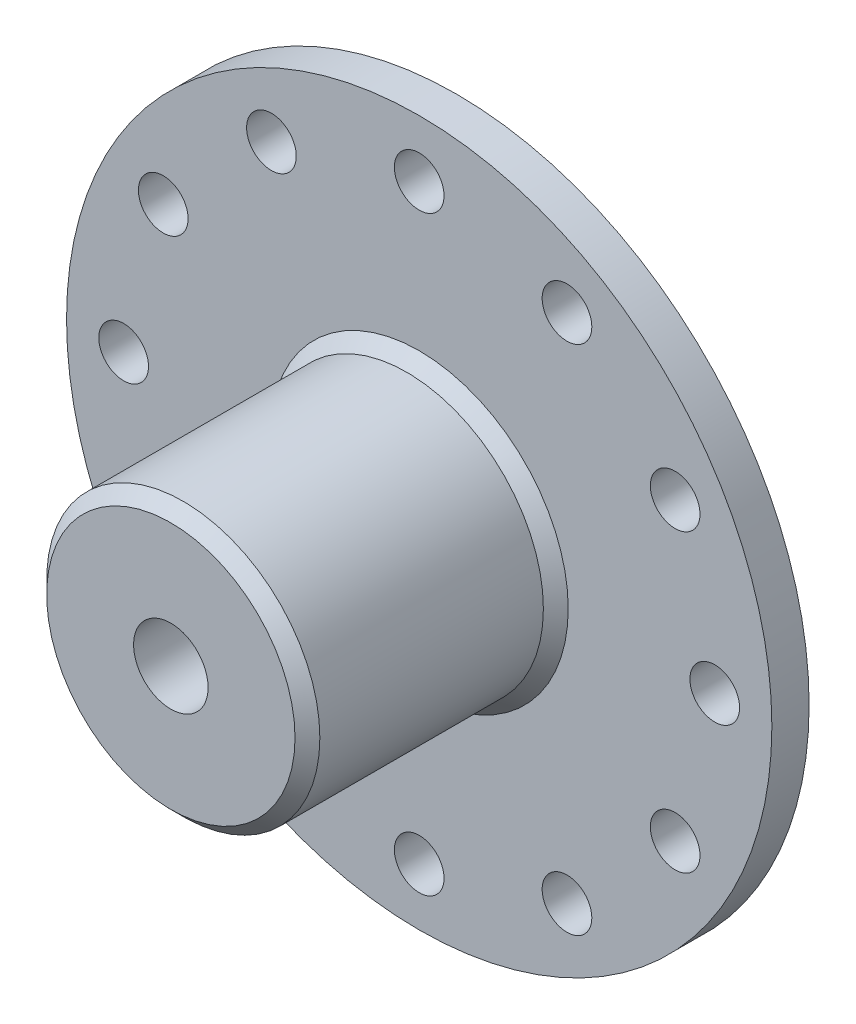
ISO-10303-21;
HEADER;
FILE_DESCRIPTION(('STEP AP214'),'2;1');
FILE_NAME('part.step','',(''),(''),'','','');
FILE_SCHEMA(('AUTOMOTIVE_DESIGN { 1 0 10303 214 1 1 1 1 }'));
ENDSEC;
DATA;
#1=APPLICATION_CONTEXT('core data for automotive mechanical design processes');
#2=APPLICATION_PROTOCOL_DEFINITION('international standard','automotive_design',2000,#1);
#3=PRODUCT_CONTEXT('',#1,'mechanical');
#4=PRODUCT('Part','Part','',(#3));
#5=PRODUCT_RELATED_PRODUCT_CATEGORY('part','',(#4));
#6=PRODUCT_DEFINITION_FORMATION('','',#4);
#7=PRODUCT_DEFINITION_CONTEXT('part definition',#1,'design');
#8=PRODUCT_DEFINITION('design','',#6,#7);
#9=PRODUCT_DEFINITION_SHAPE('','',#8);
#10=(LENGTH_UNIT() NAMED_UNIT(*) SI_UNIT(.MILLI.,.METRE.));
#11=(NAMED_UNIT(*) PLANE_ANGLE_UNIT() SI_UNIT($,.RADIAN.));
#12=(NAMED_UNIT(*) SI_UNIT($,.STERADIAN.) SOLID_ANGLE_UNIT());
#13=UNCERTAINTY_MEASURE_WITH_UNIT(LENGTH_MEASURE(1.E-05),#10,'distance_accuracy_value','');
#14=(GEOMETRIC_REPRESENTATION_CONTEXT(3) GLOBAL_UNCERTAINTY_ASSIGNED_CONTEXT((#13)) GLOBAL_UNIT_ASSIGNED_CONTEXT((#10,
#11,#12)) REPRESENTATION_CONTEXT('',''));
#15=CARTESIAN_POINT('',(0.,0.,0.));
#16=DIRECTION('',(0.,0.,1.));
#17=DIRECTION('',(1.,0.,0.));
#18=AXIS2_PLACEMENT_3D('',#15,#16,#17);
#19=CARTESIAN_POINT('',(0.,0.,3.));
#20=DIRECTION('',(0.,0.,-1.));
#21=DIRECTION('',(-1.,0.,0.));
#22=AXIS2_PLACEMENT_3D('',#19,#20,#21);
#23=CYLINDRICAL_SURFACE('',#22,28.4);
#24=CARTESIAN_POINT('',(0.,0.,3.));
#25=DIRECTION('',(0.,0.,1.));
#26=DIRECTION('',(1.,0.,0.));
#27=AXIS2_PLACEMENT_3D('',#24,#25,#26);
#28=CIRCLE('',#27,28.4);
#29=CARTESIAN_POINT('',(28.4,0.,3.));
#30=VERTEX_POINT('',#29);
#31=EDGE_CURVE('E55',#30,#30,#28,.T.);
#32=ORIENTED_EDGE('',*,*,#31,.F.);
#33=EDGE_LOOP('',(#32));
#34=FACE_BOUND('',#33,.T.);
#35=CARTESIAN_POINT('',(0.,0.,0.));
#36=DIRECTION('',(0.,0.,1.));
#37=DIRECTION('',(1.,0.,0.));
#38=AXIS2_PLACEMENT_3D('',#35,#36,#37);
#39=CIRCLE('',#38,28.4);
#40=CARTESIAN_POINT('',(28.4,0.,0.));
#41=VERTEX_POINT('',#40);
#42=EDGE_CURVE('E66',#41,#41,#39,.T.);
#43=ORIENTED_EDGE('',*,*,#42,.T.);
#44=EDGE_LOOP('',(#43));
#45=FACE_BOUND('',#44,.T.);
#46=ADVANCED_FACE('F35',(#34,#45),#23,.T.);
#47=CARTESIAN_POINT('',(0.,0.,3.));
#48=DIRECTION('',(0.,0.,1.));
#49=DIRECTION('',(1.,0.,0.));
#50=AXIS2_PLACEMENT_3D('',#47,#48,#49);
#51=PLANE('',#50);
#52=CARTESIAN_POINT('',(-11.8999999999999,20.6114046100697,3.));
#53=DIRECTION('',(0.,0.,1.));
#54=DIRECTION('',(0.499999999999998,0.86602540378444,0.));
#55=AXIS2_PLACEMENT_3D('',#52,#53,#54);
#56=CIRCLE('',#55,2.00000000000002);
#57=CARTESIAN_POINT('',(-10.8999999999999,22.3434554176386,3.));
#58=VERTEX_POINT('',#57);
#59=EDGE_CURVE('E204',#58,#58,#56,.T.);
#60=ORIENTED_EDGE('',*,*,#59,.F.);
#61=EDGE_LOOP('',(#60));
#62=FACE_BOUND('',#61,.T.);
#63=CARTESIAN_POINT('',(-20.6114046100696,11.9000000000001,3.));
#64=DIRECTION('',(0.,0.,1.));
#65=DIRECTION('',(0.,1.,0.));
#66=AXIS2_PLACEMENT_3D('',#63,#64,#65);
#67=CIRCLE('',#66,2.00000000000002);
#68=CARTESIAN_POINT('',(-20.6114046100696,13.9000000000001,3.));
#69=VERTEX_POINT('',#68);
#70=EDGE_CURVE('E198',#69,#69,#67,.T.);
#71=ORIENTED_EDGE('',*,*,#70,.F.);
#72=EDGE_LOOP('',(#71));
#73=FACE_BOUND('',#72,.T.);
#74=CARTESIAN_POINT('',(-23.8,0.,3.));
#75=DIRECTION('',(0.,0.,1.));
#76=DIRECTION('',(-0.500000000000004,0.866025403784436,0.));
#77=AXIS2_PLACEMENT_3D('',#74,#75,#76);
#78=CIRCLE('',#77,2.00000000000002);
#79=CARTESIAN_POINT('',(-24.8,1.73205080756898,3.));
#80=VERTEX_POINT('',#79);
#81=EDGE_CURVE('E192',#80,#80,#78,.T.);
#82=ORIENTED_EDGE('',*,*,#81,.F.);
#83=EDGE_LOOP('',(#82));
#84=FACE_BOUND('',#83,.T.);
#85=CARTESIAN_POINT('',(-20.6114046100697,-11.8999999999999,3.));
#86=DIRECTION('',(0.,0.,1.));
#87=DIRECTION('',(-0.866025403784442,0.499999999999995,0.));
#88=AXIS2_PLACEMENT_3D('',#85,#86,#87);
#89=CIRCLE('',#88,2.00000000000002);
#90=CARTESIAN_POINT('',(-22.3434554176386,-10.8999999999999,3.));
#91=VERTEX_POINT('',#90);
#92=EDGE_CURVE('E186',#91,#91,#89,.T.);
#93=ORIENTED_EDGE('',*,*,#92,.F.);
#94=EDGE_LOOP('',(#93));
#95=FACE_BOUND('',#94,.T.);
#96=CARTESIAN_POINT('',(-11.9000000000002,-20.6114046100695,3.));
#97=DIRECTION('',(0.,0.,1.));
#98=DIRECTION('',(-1.,0.,0.));
#99=AXIS2_PLACEMENT_3D('',#96,#97,#98);
#100=CIRCLE('',#99,2.00000000000002);
#101=CARTESIAN_POINT('',(-13.9000000000002,-20.6114046100695,3.));
#102=VERTEX_POINT('',#101);
#103=EDGE_CURVE('E180',#102,#102,#100,.T.);
#104=ORIENTED_EDGE('',*,*,#103,.F.);
#105=EDGE_LOOP('',(#104));
#106=FACE_BOUND('',#105,.T.);
#107=CARTESIAN_POINT('',(0.,-23.8,3.));
#108=DIRECTION('',(0.,0.,1.));
#109=DIRECTION('',(-0.866025403784435,-0.500000000000007,0.));
#110=AXIS2_PLACEMENT_3D('',#107,#108,#109);
#111=CIRCLE('',#110,2.00000000000002);
#112=CARTESIAN_POINT('',(-1.73205080756889,-24.8,3.));
#113=VERTEX_POINT('',#112);
#114=EDGE_CURVE('E174',#113,#113,#111,.T.);
#115=ORIENTED_EDGE('',*,*,#114,.F.);
#116=EDGE_LOOP('',(#115));
#117=FACE_BOUND('',#116,.T.);
#118=CARTESIAN_POINT('',(11.9,-20.6114046100696,3.));
#119=DIRECTION('',(0.,0.,1.));
#120=DIRECTION('',(-0.499999999999992,-0.866025403784443,0.));
#121=AXIS2_PLACEMENT_3D('',#118,#119,#120);
#122=CIRCLE('',#121,2.00000000000002);
#123=CARTESIAN_POINT('',(10.9,-22.3434554176385,3.));
#124=VERTEX_POINT('',#123);
#125=EDGE_CURVE('E168',#124,#124,#122,.T.);
#126=ORIENTED_EDGE('',*,*,#125,.F.);
#127=EDGE_LOOP('',(#126));
#128=FACE_BOUND('',#127,.T.);
#129=CARTESIAN_POINT('',(20.6114046100697,-11.9,3.));
#130=DIRECTION('',(0.,0.,1.));
#131=DIRECTION('',(0.,-1.,0.));
#132=AXIS2_PLACEMENT_3D('',#129,#130,#131);
#133=CIRCLE('',#132,2.00000000000002);
#134=CARTESIAN_POINT('',(20.6114046100697,-13.9,3.));
#135=VERTEX_POINT('',#134);
#136=EDGE_CURVE('E162',#135,#135,#133,.T.);
#137=ORIENTED_EDGE('',*,*,#136,.F.);
#138=EDGE_LOOP('',(#137));
#139=FACE_BOUND('',#138,.T.);
#140=CARTESIAN_POINT('',(23.8,0.,3.));
#141=DIRECTION('',(0.,0.,1.));
#142=DIRECTION('',(0.50000000000001,-0.866025403784433,0.));
#143=AXIS2_PLACEMENT_3D('',#140,#141,#142);
#144=CIRCLE('',#143,2.00000000000002);
#145=CARTESIAN_POINT('',(24.8,-1.7320508075688,3.));
#146=VERTEX_POINT('',#145);
#147=EDGE_CURVE('E156',#146,#146,#144,.T.);
#148=ORIENTED_EDGE('',*,*,#147,.F.);
#149=EDGE_LOOP('',(#148));
#150=FACE_BOUND('',#149,.T.);
#151=CARTESIAN_POINT('',(20.6114046100696,11.9000000000001,3.));
#152=DIRECTION('',(0.,0.,1.));
#153=DIRECTION('',(0.866025403784445,-0.499999999999989,0.));
#154=AXIS2_PLACEMENT_3D('',#151,#152,#153);
#155=CIRCLE('',#154,2.00000000000002);
#156=CARTESIAN_POINT('',(22.3434554176385,10.9000000000001,3.));
#157=VERTEX_POINT('',#156);
#158=EDGE_CURVE('E150',#157,#157,#155,.T.);
#159=ORIENTED_EDGE('',*,*,#158,.F.);
#160=EDGE_LOOP('',(#159));
#161=FACE_BOUND('',#160,.T.);
#162=CARTESIAN_POINT('',(1.73472347597681E-13,23.8,3.));
#163=DIRECTION('',(0.,0.,1.));
#164=DIRECTION('',(0.866025403784438,0.500000000000001,0.));
#165=AXIS2_PLACEMENT_3D('',#162,#163,#164);
#166=CIRCLE('',#165,2.00000000000002);
#167=CARTESIAN_POINT('',(1.73205080756906,24.8,3.));
#168=VERTEX_POINT('',#167);
#169=EDGE_CURVE('E142',#168,#168,#166,.T.);
#170=ORIENTED_EDGE('',*,*,#169,.F.);
#171=EDGE_LOOP('',(#170));
#172=FACE_BOUND('',#171,.T.);
#173=CARTESIAN_POINT('',(11.9000000000002,20.6114046100695,3.));
#174=DIRECTION('',(0.,0.,1.));
#175=DIRECTION('',(1.,0.,0.));
#176=AXIS2_PLACEMENT_3D('',#173,#174,#175);
#177=CIRCLE('',#176,2.00000000000002);
#178=CARTESIAN_POINT('',(13.9000000000002,20.6114046100695,3.));
#179=VERTEX_POINT('',#178);
#180=EDGE_CURVE('E89',#179,#179,#177,.T.);
#181=ORIENTED_EDGE('',*,*,#180,.F.);
#182=EDGE_LOOP('',(#181));
#183=FACE_BOUND('',#182,.T.);
#184=CARTESIAN_POINT('',(0.,0.,3.));
#185=DIRECTION('',(0.,0.,1.));
#186=DIRECTION('',(1.,0.,0.));
#187=AXIS2_PLACEMENT_3D('',#184,#185,#186);
#188=CIRCLE('',#187,12.);
#189=CARTESIAN_POINT('',(12.,0.,3.));
#190=VERTEX_POINT('',#189);
#191=EDGE_CURVE('E42',#190,#190,#188,.F.);
#192=ORIENTED_EDGE('',*,*,#191,.T.);
#193=EDGE_LOOP('',(#192));
#194=FACE_BOUND('',#193,.T.);
#195=ORIENTED_EDGE('',*,*,#31,.T.);
#196=EDGE_LOOP('',(#195));
#197=FACE_BOUND('',#196,.T.);
#198=ADVANCED_FACE('F100',(#62,#73,#84,#95,#106,#117,#128,#139,#150,#161,#172,#183,#194,#197),
#51,.T.);
#199=CARTESIAN_POINT('',(0.,0.,0.));
#200=DIRECTION('',(0.,0.,1.));
#201=DIRECTION('',(1.,0.,0.));
#202=AXIS2_PLACEMENT_3D('',#199,#200,#201);
#203=PLANE('',#202);
#204=CARTESIAN_POINT('',(-11.8999999999999,20.6114046100697,0.));
#205=DIRECTION('',(0.,0.,1.));
#206=DIRECTION('',(0.499999999999998,0.86602540378444,0.));
#207=AXIS2_PLACEMENT_3D('',#204,#205,#206);
#208=CIRCLE('',#207,2.00000000000002);
#209=CARTESIAN_POINT('',(-10.8999999999999,22.3434554176386,0.));
#210=VERTEX_POINT('',#209);
#211=EDGE_CURVE('E147',#210,#210,#208,.T.);
#212=ORIENTED_EDGE('',*,*,#211,.T.);
#213=EDGE_LOOP('',(#212));
#214=FACE_BOUND('',#213,.T.);
#215=CARTESIAN_POINT('',(-20.6114046100696,11.9000000000001,0.));
#216=DIRECTION('',(0.,0.,1.));
#217=DIRECTION('',(0.,1.,0.));
#218=AXIS2_PLACEMENT_3D('',#215,#216,#217);
#219=CIRCLE('',#218,2.00000000000002);
#220=CARTESIAN_POINT('',(-20.6114046100696,13.9000000000001,0.));
#221=VERTEX_POINT('',#220);
#222=EDGE_CURVE('E201',#221,#221,#219,.T.);
#223=ORIENTED_EDGE('',*,*,#222,.T.);
#224=EDGE_LOOP('',(#223));
#225=FACE_BOUND('',#224,.T.);
#226=CARTESIAN_POINT('',(-23.8,0.,0.));
#227=DIRECTION('',(0.,0.,1.));
#228=DIRECTION('',(-0.500000000000004,0.866025403784436,0.));
#229=AXIS2_PLACEMENT_3D('',#226,#227,#228);
#230=CIRCLE('',#229,2.00000000000002);
#231=CARTESIAN_POINT('',(-24.8,1.73205080756898,0.));
#232=VERTEX_POINT('',#231);
#233=EDGE_CURVE('E195',#232,#232,#230,.T.);
#234=ORIENTED_EDGE('',*,*,#233,.T.);
#235=EDGE_LOOP('',(#234));
#236=FACE_BOUND('',#235,.T.);
#237=CARTESIAN_POINT('',(-20.6114046100697,-11.8999999999999,0.));
#238=DIRECTION('',(0.,0.,1.));
#239=DIRECTION('',(-0.866025403784442,0.499999999999995,0.));
#240=AXIS2_PLACEMENT_3D('',#237,#238,#239);
#241=CIRCLE('',#240,2.00000000000002);
#242=CARTESIAN_POINT('',(-22.3434554176386,-10.8999999999999,0.));
#243=VERTEX_POINT('',#242);
#244=EDGE_CURVE('E189',#243,#243,#241,.T.);
#245=ORIENTED_EDGE('',*,*,#244,.T.);
#246=EDGE_LOOP('',(#245));
#247=FACE_BOUND('',#246,.T.);
#248=CARTESIAN_POINT('',(-11.9000000000002,-20.6114046100695,0.));
#249=DIRECTION('',(0.,0.,1.));
#250=DIRECTION('',(-1.,0.,0.));
#251=AXIS2_PLACEMENT_3D('',#248,#249,#250);
#252=CIRCLE('',#251,2.00000000000002);
#253=CARTESIAN_POINT('',(-13.9000000000002,-20.6114046100695,0.));
#254=VERTEX_POINT('',#253);
#255=EDGE_CURVE('E183',#254,#254,#252,.T.);
#256=ORIENTED_EDGE('',*,*,#255,.T.);
#257=EDGE_LOOP('',(#256));
#258=FACE_BOUND('',#257,.T.);
#259=CARTESIAN_POINT('',(0.,-23.8,0.));
#260=DIRECTION('',(0.,0.,1.));
#261=DIRECTION('',(-0.866025403784435,-0.500000000000007,0.));
#262=AXIS2_PLACEMENT_3D('',#259,#260,#261);
#263=CIRCLE('',#262,2.00000000000002);
#264=CARTESIAN_POINT('',(-1.73205080756889,-24.8,0.));
#265=VERTEX_POINT('',#264);
#266=EDGE_CURVE('E177',#265,#265,#263,.T.);
#267=ORIENTED_EDGE('',*,*,#266,.T.);
#268=EDGE_LOOP('',(#267));
#269=FACE_BOUND('',#268,.T.);
#270=CARTESIAN_POINT('',(11.9,-20.6114046100696,0.));
#271=DIRECTION('',(0.,0.,1.));
#272=DIRECTION('',(-0.499999999999992,-0.866025403784443,0.));
#273=AXIS2_PLACEMENT_3D('',#270,#271,#272);
#274=CIRCLE('',#273,2.00000000000002);
#275=CARTESIAN_POINT('',(10.9,-22.3434554176385,0.));
#276=VERTEX_POINT('',#275);
#277=EDGE_CURVE('E171',#276,#276,#274,.T.);
#278=ORIENTED_EDGE('',*,*,#277,.T.);
#279=EDGE_LOOP('',(#278));
#280=FACE_BOUND('',#279,.T.);
#281=CARTESIAN_POINT('',(20.6114046100697,-11.9,0.));
#282=DIRECTION('',(0.,0.,1.));
#283=DIRECTION('',(0.,-1.,0.));
#284=AXIS2_PLACEMENT_3D('',#281,#282,#283);
#285=CIRCLE('',#284,2.00000000000002);
#286=CARTESIAN_POINT('',(20.6114046100697,-13.9,0.));
#287=VERTEX_POINT('',#286);
#288=EDGE_CURVE('E165',#287,#287,#285,.T.);
#289=ORIENTED_EDGE('',*,*,#288,.T.);
#290=EDGE_LOOP('',(#289));
#291=FACE_BOUND('',#290,.T.);
#292=CARTESIAN_POINT('',(23.8,0.,0.));
#293=DIRECTION('',(0.,0.,1.));
#294=DIRECTION('',(0.50000000000001,-0.866025403784433,0.));
#295=AXIS2_PLACEMENT_3D('',#292,#293,#294);
#296=CIRCLE('',#295,2.00000000000002);
#297=CARTESIAN_POINT('',(24.8,-1.7320508075688,0.));
#298=VERTEX_POINT('',#297);
#299=EDGE_CURVE('E159',#298,#298,#296,.T.);
#300=ORIENTED_EDGE('',*,*,#299,.T.);
#301=EDGE_LOOP('',(#300));
#302=FACE_BOUND('',#301,.T.);
#303=CARTESIAN_POINT('',(20.6114046100696,11.9000000000001,0.));
#304=DIRECTION('',(0.,0.,1.));
#305=DIRECTION('',(0.866025403784445,-0.499999999999989,0.));
#306=AXIS2_PLACEMENT_3D('',#303,#304,#305);
#307=CIRCLE('',#306,2.00000000000002);
#308=CARTESIAN_POINT('',(22.3434554176385,10.9000000000001,0.));
#309=VERTEX_POINT('',#308);
#310=EDGE_CURVE('E153',#309,#309,#307,.T.);
#311=ORIENTED_EDGE('',*,*,#310,.T.);
#312=EDGE_LOOP('',(#311));
#313=FACE_BOUND('',#312,.T.);
#314=CARTESIAN_POINT('',(1.73472347597681E-13,23.8,0.));
#315=DIRECTION('',(0.,0.,1.));
#316=DIRECTION('',(0.866025403784438,0.500000000000001,0.));
#317=AXIS2_PLACEMENT_3D('',#314,#315,#316);
#318=CIRCLE('',#317,2.00000000000002);
#319=CARTESIAN_POINT('',(1.73205080756906,24.8,0.));
#320=VERTEX_POINT('',#319);
#321=EDGE_CURVE('E140',#320,#320,#318,.T.);
#322=ORIENTED_EDGE('',*,*,#321,.T.);
#323=EDGE_LOOP('',(#322));
#324=FACE_BOUND('',#323,.T.);
#325=CARTESIAN_POINT('',(11.9000000000002,20.6114046100695,0.));
#326=DIRECTION('',(0.,0.,1.));
#327=DIRECTION('',(1.,0.,0.));
#328=AXIS2_PLACEMENT_3D('',#325,#326,#327);
#329=CIRCLE('',#328,2.00000000000002);
#330=CARTESIAN_POINT('',(13.9000000000002,20.6114046100695,0.));
#331=VERTEX_POINT('',#330);
#332=EDGE_CURVE('E65',#331,#331,#329,.T.);
#333=ORIENTED_EDGE('',*,*,#332,.T.);
#334=EDGE_LOOP('',(#333));
#335=FACE_BOUND('',#334,.T.);
#336=CARTESIAN_POINT('',(0.,0.,0.));
#337=DIRECTION('',(0.,0.,1.));
#338=DIRECTION('',(1.,0.,0.));
#339=AXIS2_PLACEMENT_3D('',#336,#337,#338);
#340=CIRCLE('',#339,3.);
#341=CARTESIAN_POINT('',(3.,0.,0.));
#342=VERTEX_POINT('',#341);
#343=EDGE_CURVE('E91',#342,#342,#340,.T.);
#344=ORIENTED_EDGE('',*,*,#343,.T.);
#345=EDGE_LOOP('',(#344));
#346=FACE_BOUND('',#345,.T.);
#347=ORIENTED_EDGE('',*,*,#42,.F.);
#348=EDGE_LOOP('',(#347));
#349=FACE_BOUND('',#348,.T.);
#350=ADVANCED_FACE('F98',(#214,#225,#236,#247,#258,#269,#280,#291,#302,#313,#324,#335,#346,
#349),#203,.F.);
#351=CARTESIAN_POINT('',(0.,0.,23.));
#352=DIRECTION('',(0.,0.,-1.));
#353=DIRECTION('',(-1.,0.,0.));
#354=AXIS2_PLACEMENT_3D('',#351,#352,#353);
#355=CYLINDRICAL_SURFACE('',#354,11.);
#356=CARTESIAN_POINT('',(0.,0.,4.00000000000001));
#357=DIRECTION('',(0.,0.,1.));
#358=DIRECTION('',(1.,0.,0.));
#359=AXIS2_PLACEMENT_3D('',#356,#357,#358);
#360=CIRCLE('',#359,11.);
#361=CARTESIAN_POINT('',(11.,0.,4.00000000000001));
#362=VERTEX_POINT('',#361);
#363=EDGE_CURVE('E46',#362,#362,#360,.T.);
#364=ORIENTED_EDGE('',*,*,#363,.T.);
#365=EDGE_LOOP('',(#364));
#366=FACE_BOUND('',#365,.T.);
#367=CARTESIAN_POINT('',(0.,0.,22.));
#368=DIRECTION('',(0.,0.,1.));
#369=DIRECTION('',(1.,0.,0.));
#370=AXIS2_PLACEMENT_3D('',#367,#368,#369);
#371=CIRCLE('',#370,11.);
#372=CARTESIAN_POINT('',(11.,0.,22.));
#373=VERTEX_POINT('',#372);
#374=EDGE_CURVE('E50',#373,#373,#371,.F.);
#375=ORIENTED_EDGE('',*,*,#374,.T.);
#376=EDGE_LOOP('',(#375));
#377=FACE_BOUND('',#376,.T.);
#378=CARTESIAN_POINT('',(0.,-11.,17.));
#379=CARTESIAN_POINT('',(0.111357271644373,-10.9999980072786,16.9999956813393));
#380=CARTESIAN_POINT('',(0.222771449918202,-10.9982915273343,16.9906682425174));
#381=CARTESIAN_POINT('',(0.442464406848309,-10.99164847502,16.9536265339751));
#382=CARTESIAN_POINT('',(0.550740387266074,-10.9867091072254,16.9258963514186));
#383=CARTESIAN_POINT('',(0.760947572513749,-10.9741532323507,16.852922870329));
#384=CARTESIAN_POINT('',(0.862884263930179,-10.9665390793192,16.8076949678102));
#385=CARTESIAN_POINT('',(1.0577120033845,-10.949466714983,16.7010526688082));
#386=CARTESIAN_POINT('',(1.15060386767905,-10.9400086703132,16.6396397348118));
#387=CARTESIAN_POINT('',(1.32576444051239,-10.9201743349983,16.5016340903573));
#388=CARTESIAN_POINT('',(1.40791622603346,-10.9097897259708,16.4248941580192));
#389=CARTESIAN_POINT('',(1.55825357341079,-10.8893349521181,16.2587296459102));
#390=CARTESIAN_POINT('',(1.62643816794977,-10.8792648091126,16.1693041883108));
#391=CARTESIAN_POINT('',(1.74738695016477,-10.8604984020977,15.9794872705402));
#392=CARTESIAN_POINT('',(1.80003313265556,-10.851812871101,15.8790194647696));
#393=CARTESIAN_POINT('',(1.88765546949978,-10.836915832769,15.670481349676));
#394=CARTESIAN_POINT('',(1.92263305283275,-10.8307041253674,15.562411655975));
#395=CARTESIAN_POINT('',(1.97355197711315,-10.8215415351671,15.3429853506434));
#396=CARTESIAN_POINT('',(1.98969666425445,-10.8185558462234,15.2316774082904));
#397=CARTESIAN_POINT('',(2.00312248736688,-10.8160783143231,15.0078955926854));
#398=CARTESIAN_POINT('',(2.00040521296643,-10.8165861769405,14.895421818484));
#399=CARTESIAN_POINT('',(1.97634934427,-10.8210066504918,14.673968085867));
#400=CARTESIAN_POINT('',(1.95524117699072,-10.8248771281426,14.5649621321043));
#401=CARTESIAN_POINT('',(1.89536523340026,-10.8355206127391,14.3520649816328));
#402=CARTESIAN_POINT('',(1.85659674743188,-10.8422937363232,14.2481739906482));
#403=CARTESIAN_POINT('',(1.76227297789295,-10.8580238155272,14.0477772092213));
#404=CARTESIAN_POINT('',(1.7066239037154,-10.8669929171435,13.9513165573339));
#405=CARTESIAN_POINT('',(1.58018503374043,-10.8860962201172,13.7690152630547));
#406=CARTESIAN_POINT('',(1.50939379023584,-10.8962305328347,13.6831756373538));
#407=CARTESIAN_POINT('',(1.35343399418352,-10.9167064080854,13.5232210035556));
#408=CARTESIAN_POINT('',(1.2680681726569,-10.9270488181647,13.4492983115631));
#409=CARTESIAN_POINT('',(1.08604454069331,-10.9466375043709,13.3167948665192));
#410=CARTESIAN_POINT('',(0.989386629498157,-10.9558837707156,13.2582142503787));
#411=CARTESIAN_POINT('',(0.787327598497296,-10.9722553782534,13.158032610215));
#412=CARTESIAN_POINT('',(0.681916780395491,-10.9793783255922,13.116450731304));
#413=CARTESIAN_POINT('',(0.465448414462665,-10.9906820547088,13.0516368075063));
#414=CARTESIAN_POINT('',(0.354391431316063,-10.994863130091,13.0284029314261));
#415=CARTESIAN_POINT('',(0.131438649578498,-10.9997719337866,13.0012102380809));
#416=CARTESIAN_POINT('',(0.019576012108933,-11.0005468934114,12.9969877765459));
#417=CARTESIAN_POINT('',(-0.203257238970968,-10.998686302475,13.0072317981815));
#418=CARTESIAN_POINT('',(-0.314227893453083,-10.9960509090871,13.0216974200717));
#419=CARTESIAN_POINT('',(-0.531297097592759,-10.9876950863245,13.0686877495619));
#420=CARTESIAN_POINT('',(-0.637425297458318,-10.9819973157216,13.1010798691828));
#421=CARTESIAN_POINT('',(-0.842744713756611,-10.9681529512222,13.1828608285219));
#422=CARTESIAN_POINT('',(-0.94193548096095,-10.9600061989244,13.2322507676977));
#423=CARTESIAN_POINT('',(-1.13169524707494,-10.9420497958484,13.3472146378029));
#424=CARTESIAN_POINT('',(-1.22216445208488,-10.932223816146,13.4129506871559));
#425=CARTESIAN_POINT('',(-1.39088213822347,-10.9120428807109,13.5585203766711));
#426=CARTESIAN_POINT('',(-1.46912954974332,-10.901687878785,13.6383552494119));
#427=CARTESIAN_POINT('',(-1.6121773788768,-10.8814603955764,13.8110468814485));
#428=CARTESIAN_POINT('',(-1.67679836741418,-10.8715955212189,13.9040533065259));
#429=CARTESIAN_POINT('',(-1.78949986552014,-10.8536151008102,14.0997561814065));
#430=CARTESIAN_POINT('',(-1.83758096630795,-10.8454994922354,14.2024522846844));
#431=CARTESIAN_POINT('',(-1.91557945241746,-10.8319954461548,14.4141507496917));
#432=CARTESIAN_POINT('',(-1.9455810786184,-10.8265943801675,14.5231212307381));
#433=CARTESIAN_POINT('',(-1.98683040178554,-10.8191012654539,14.7446629886311));
#434=CARTESIAN_POINT('',(-1.99808007453629,-10.8170088681136,14.8572338848489));
#435=CARTESIAN_POINT('',(-2.00144313663184,-10.8163869388262,15.0809853754636));
#436=CARTESIAN_POINT('',(-1.99383937001232,-10.8178047454411,15.1921616714385));
#437=CARTESIAN_POINT('',(-1.96032846912815,-10.8239270874703,15.4116236380174));
#438=CARTESIAN_POINT('',(-1.93442142905718,-10.8286316059701,15.5199093234943));
#439=CARTESIAN_POINT('',(-1.86515567158476,-10.8407757208091,15.7303761973954));
#440=CARTESIAN_POINT('',(-1.82182581019232,-10.8482107929975,15.8325671602234));
#441=CARTESIAN_POINT('',(-1.71897473664823,-10.8649817751485,16.0282744471647));
#442=CARTESIAN_POINT('',(-1.65945247569007,-10.8743178082294,16.1217902088456));
#443=CARTESIAN_POINT('',(-1.52491543662799,-10.8940032465147,16.2989128745956));
#444=CARTESIAN_POINT('',(-1.44969415553099,-10.9043650783111,16.3823615698708));
#445=CARTESIAN_POINT('',(-1.28632651423364,-10.9248399206865,16.5355470810122));
#446=CARTESIAN_POINT('',(-1.19817718680093,-10.9349528735191,16.6052807403922));
#447=CARTESIAN_POINT('',(-1.0105711896463,-10.9538897429719,16.7296002971235));
#448=CARTESIAN_POINT('',(-0.911025849790496,-10.9627021317343,16.7840541851801));
#449=CARTESIAN_POINT('',(-0.704073905086345,-10.9779326099335,16.8753792160741));
#450=CARTESIAN_POINT('',(-0.596674925486671,-10.9843529858473,16.9122671592783));
#451=CARTESIAN_POINT('',(-0.407441749458407,-10.9927407037649,16.9597754303022));
#452=CARTESIAN_POINT('',(-0.326725427276491,-10.9954478027358,16.9748343329604));
#453=CARTESIAN_POINT('',(-0.164016342132203,-10.9990781643304,16.9949480937949));
#454=CARTESIAN_POINT('',(-0.0820236084408332,-11.0000014678,17.0000031810418));
#455=CARTESIAN_POINT('',(0.,-11.,17.));
#456=B_SPLINE_CURVE_WITH_KNOTS('',3,(#378,#379,#380,#381,#382,#383,#384,#385,#386,#387,#388,
#389,#390,#391,#392,#393,#394,#395,#396,#397,#398,#399,#400,#401,#402,#403,#404,#405,#406,#407,
#408,#409,#410,#411,#412,#413,#414,#415,#416,#417,#418,#419,#420,#421,#422,#423,#424,#425,#426,
#427,#428,#429,#430,#431,#432,#433,#434,#435,#436,#437,#438,#439,#440,#441,#442,#443,#444,#445,
#446,#447,#448,#449,#450,#451,#452,#453,#454,#455),.UNSPECIFIED.,.T.,.F.,(4,2,2,2,2,2,2,2,2,2,2,
2,2,2,2,2,2,2,2,2,2,2,2,2,2,2,2,2,2,2,2,2,2,2,2,2,2,2,4),(0.,0.333771891552332,
0.667832772072591,1.00160038286675,1.3353378446015,1.67245014596885,2.00958578663079,
2.3492195220365,2.6888257845573,3.02473021172645,3.36060633024203,3.69233367290895,
4.02407434678871,4.35769306461625,4.69134369321255,5.02993210441872,5.36852353704646,
5.70749527023812,6.04643316861453,6.38065600997364,6.71486344850797,7.0466314328543,
7.37842088074221,7.71364226795666,8.04889297616123,8.38831506130458,8.72772501252474,
9.06554101076157,9.40332141303601,9.73606509730371,10.0688070691931,10.4010002025896,
10.733214857769,11.0701111453004,11.4070848782946,11.7468860454293,12.0863615649817,
12.3322171022956,12.5780670098676),.UNSPECIFIED.);
#457=CARTESIAN_POINT('',(0.,-11.,17.));
#458=VERTEX_POINT('',#457);
#459=EDGE_CURVE('E64',#458,#458,#456,.T.);
#460=ORIENTED_EDGE('',*,*,#459,.T.);
#461=EDGE_LOOP('',(#460));
#462=FACE_BOUND('',#461,.T.);
#463=ADVANCED_FACE('F93',(#366,#377,#462),#355,.T.);
#464=CARTESIAN_POINT('',(0.,0.,23.));
#465=DIRECTION('',(0.,0.,1.));
#466=DIRECTION('',(1.,0.,0.));
#467=AXIS2_PLACEMENT_3D('',#464,#465,#466);
#468=PLANE('',#467);
#469=CARTESIAN_POINT('',(0.,0.,23.));
#470=DIRECTION('',(0.,0.,1.));
#471=DIRECTION('',(1.,0.,0.));
#472=AXIS2_PLACEMENT_3D('',#469,#470,#471);
#473=CIRCLE('',#472,10.);
#474=CARTESIAN_POINT('',(10.,0.,23.));
#475=VERTEX_POINT('',#474);
#476=EDGE_CURVE('E10',#475,#475,#473,.T.);
#477=ORIENTED_EDGE('',*,*,#476,.T.);
#478=EDGE_LOOP('',(#477));
#479=FACE_BOUND('',#478,.T.);
#480=CARTESIAN_POINT('',(0.,0.,23.));
#481=DIRECTION('',(0.,0.,1.));
#482=DIRECTION('',(1.,0.,0.));
#483=AXIS2_PLACEMENT_3D('',#480,#481,#482);
#484=CIRCLE('',#483,3.);
#485=CARTESIAN_POINT('',(3.,0.,23.));
#486=VERTEX_POINT('',#485);
#487=EDGE_CURVE('E88',#486,#486,#484,.T.);
#488=ORIENTED_EDGE('',*,*,#487,.F.);
#489=EDGE_LOOP('',(#488));
#490=FACE_BOUND('',#489,.T.);
#491=ADVANCED_FACE('F97',(#479,#490),#468,.T.);
#492=CARTESIAN_POINT('',(0.,0.,0.));
#493=DIRECTION('',(0.,0.,1.));
#494=DIRECTION('',(1.,0.,0.));
#495=AXIS2_PLACEMENT_3D('',#492,#493,#494);
#496=CYLINDRICAL_SURFACE('',#495,3.);
#497=CARTESIAN_POINT('',(0.,-3.,17.));
#498=CARTESIAN_POINT('',(-0.100484716668078,-3.0000004164484,17.0000005496325));
#499=CARTESIAN_POINT('',(-0.200969087132901,-2.99490802753388,16.9923860300445));
#500=CARTESIAN_POINT('',(-0.398733058031681,-2.97504652423809,16.9624031358943));
#501=CARTESIAN_POINT('',(-0.496011113955007,-2.96027281581235,16.9400277568767));
#502=CARTESIAN_POINT('',(-0.684212307854249,-2.92250482404708,16.8818922826752));
#503=CARTESIAN_POINT('',(-0.775162872657555,-2.89954905493315,16.8461948599921));
#504=CARTESIAN_POINT('',(-0.94941529099726,-2.8472613787744,16.7629366367285));
#505=CARTESIAN_POINT('',(-1.03271603160967,-2.8179285460551,16.7153741136994));
#506=CARTESIAN_POINT('',(-1.19728470077011,-2.75227329369838,16.6053430626326));
#507=CARTESIAN_POINT('',(-1.27778030546067,-2.71556897579319,16.5419521392571));
#508=CARTESIAN_POINT('',(-1.42772804469274,-2.63982313083466,16.4042699513416));
#509=CARTESIAN_POINT('',(-1.49716405543888,-2.60077830356832,16.3299630701623));
#510=CARTESIAN_POINT('',(-1.63422297745496,-2.51728264678794,16.1589476323873));
#511=CARTESIAN_POINT('',(-1.6998318636275,-2.47295067937795,16.0605543467965));
#512=CARTESIAN_POINT('',(-1.81350357014175,-2.3908414735282,15.8516366223535));
#513=CARTESIAN_POINT('',(-1.86159673426503,-2.35305295954668,15.7411335984373));
#514=CARTESIAN_POINT('',(-1.92674035011438,-2.29976266641461,15.5432887065784));
#515=CARTESIAN_POINT('',(-1.94874447236008,-2.28097627892403,15.4584715471261));
#516=CARTESIAN_POINT('',(-1.98150617785228,-2.25257969659604,15.2852554952583));
#517=CARTESIAN_POINT('',(-1.99228314651963,-2.24295368744147,15.1968630512739));
#518=CARTESIAN_POINT('',(-2.00191364141227,-2.23436605608045,15.0185252211435));
#519=CARTESIAN_POINT('',(-2.00071842917524,-2.23544802558502,14.9285749765476));
#520=CARTESIAN_POINT('',(-1.98637581333356,-2.24819775483425,14.7503650265002));
#521=CARTESIAN_POINT('',(-1.97321828380393,-2.25987448286881,14.6621068179719));
#522=CARTESIAN_POINT('',(-1.93664994217326,-2.2912718598996,14.4935329487581));
#523=CARTESIAN_POINT('',(-1.91371711479477,-2.31061488324375,14.4130386640612));
#524=CARTESIAN_POINT('',(-1.85870118583424,-2.35509622933623,14.2569763090242));
#525=CARTESIAN_POINT('',(-1.8266150732855,-2.3802364585489,14.1814098697613));
#526=CARTESIAN_POINT('',(-1.74673818732648,-2.43964196377947,14.0209746046436));
#527=CARTESIAN_POINT('',(-1.69708052300444,-2.47472317740627,13.9373400995169));
#528=CARTESIAN_POINT('',(-1.5866896043822,-2.54691537733438,13.7786166047142));
#529=CARTESIAN_POINT('',(-1.52594268999614,-2.58402882709328,13.7035383422379));
#530=CARTESIAN_POINT('',(-1.37981165322308,-2.66543343763725,13.5474574543966));
#531=CARTESIAN_POINT('',(-1.29193938283656,-2.70954744720561,13.4686659513172));
#532=CARTESIAN_POINT('',(-1.10200799908007,-2.79218100665212,13.3268035054615));
#533=CARTESIAN_POINT('',(-0.999962299343691,-2.83070577648042,13.263717854591));
#534=CARTESIAN_POINT('',(-0.804857827096524,-2.89145404090364,13.1665222813771));
#535=CARTESIAN_POINT('',(-0.713957643371904,-2.9153926116554,13.1291566366611));
#536=CARTESIAN_POINT('',(-0.526036043935474,-2.95507719030499,13.0678950743746));
#537=CARTESIAN_POINT('',(-0.429019879001644,-2.97083012127544,13.0439877728678));
#538=CARTESIAN_POINT('',(-0.230985453172275,-2.99275882156808,13.010838834762));
#539=CARTESIAN_POINT('',(-0.129951811934152,-2.99889322461187,13.0016605390617));
#540=CARTESIAN_POINT('',(0.0724415193893518,-3.00083114965147,12.9987529114378));
#541=CARTESIAN_POINT('',(0.17380118618663,-2.99663539385634,13.0050224995112));
#542=CARTESIAN_POINT('',(0.366455717204244,-2.97899589424273,13.031624055562));
#543=CARTESIAN_POINT('',(0.457957444679197,-2.96622246390226,13.0509372977552));
#544=CARTESIAN_POINT('',(0.636116392427405,-2.93318449284837,13.1015956860129));
#545=CARTESIAN_POINT('',(0.722772837571137,-2.91291875746989,13.1329427509282));
#546=CARTESIAN_POINT('',(0.894664750466001,-2.86496352529157,13.2086522970449));
#547=CARTESIAN_POINT('',(0.979496184631423,-2.83689870135785,13.2536881540819));
#548=CARTESIAN_POINT('',(1.1406830239573,-2.7760185561151,13.3544332899463));
#549=CARTESIAN_POINT('',(1.21703314820091,-2.74320030403941,13.4101491605322));
#550=CARTESIAN_POINT('',(1.37185445482324,-2.6695454665343,13.5406078681575));
#551=CARTESIAN_POINT('',(1.44875187569565,-2.62826156800165,13.6169662600751));
#552=CARTESIAN_POINT('',(1.58933968069449,-2.54571173085957,13.7811114299571));
#553=CARTESIAN_POINT('',(1.6530209365723,-2.50444582417845,13.8689060391075));
#554=CARTESIAN_POINT('',(1.76124776549314,-2.4293967897058,14.0471424127681));
#555=CARTESIAN_POINT('',(1.80695636125283,-2.39527597025701,14.1367320334622));
#556=CARTESIAN_POINT('',(1.88496213740264,-2.33438974266154,14.3238726524436));
#557=CARTESIAN_POINT('',(1.91728345682189,-2.30761112529822,14.4214089383046));
#558=CARTESIAN_POINT('',(1.9623584346534,-2.26933208182633,14.6045644871954));
#559=CARTESIAN_POINT('',(1.97758597566225,-2.25594998021257,14.689171809876));
#560=CARTESIAN_POINT('',(1.99699205923373,-2.23879466438398,14.8605732813184));
#561=CARTESIAN_POINT('',(2.00118260285317,-2.23501101347816,14.9473649511395));
#562=CARTESIAN_POINT('',(1.99823921981266,-2.23764201149981,15.1206430567237));
#563=CARTESIAN_POINT('',(1.99109858767783,-2.24406269907463,15.2071292813738));
#564=CARTESIAN_POINT('',(1.96596997224746,-2.26610452403491,15.3773435285321));
#565=CARTESIAN_POINT('',(1.94796751728257,-2.28173793527615,15.4610677138243));
#566=CARTESIAN_POINT('',(1.89593035657494,-2.32526843904801,15.6457111864812));
#567=CARTESIAN_POINT('',(1.85890187130765,-2.35532333574983,15.7452677129433));
#568=CARTESIAN_POINT('',(1.7708452623622,-2.42222161121309,15.9354868343842));
#569=CARTESIAN_POINT('',(1.71979748341259,-2.459074496867,16.0261366979917));
#570=CARTESIAN_POINT('',(1.60398280555152,-2.53617186577119,16.1992818871362));
#571=CARTESIAN_POINT('',(1.5389830989402,-2.5764658739228,16.2815987454231));
#572=CARTESIAN_POINT('',(1.39671768031094,-2.65628301537844,16.4353224782579));
#573=CARTESIAN_POINT('',(1.31944821025748,-2.69580590832396,16.5067259970292));
#574=CARTESIAN_POINT('',(1.14145732976973,-2.77631551964083,16.6467121043091));
#575=CARTESIAN_POINT('',(1.03896166955574,-2.81669805449991,16.7134186401783));
#576=CARTESIAN_POINT('',(0.820868555771208,-2.88777665874161,16.8279132766653));
#577=CARTESIAN_POINT('',(0.705292062449148,-2.91848793445255,16.875731106824));
#578=CARTESIAN_POINT('',(0.491435069835737,-2.96101644836895,16.9411545781638));
#579=CARTESIAN_POINT('',(0.395012325257914,-2.97551480368935,16.9631110390986));
#580=CARTESIAN_POINT('',(0.199058012023941,-2.99500280141853,16.9925280325381));
#581=CARTESIAN_POINT('',(0.0995288361880056,-2.99999958751315,16.999999455596));
#582=CARTESIAN_POINT('',(0.,-3.,17.));
#583=B_SPLINE_CURVE_WITH_KNOTS('',3,(#497,#498,#499,#500,#501,#502,#503,#504,#505,#506,#507,
#508,#509,#510,#511,#512,#513,#514,#515,#516,#517,#518,#519,#520,#521,#522,#523,#524,#525,#526,
#527,#528,#529,#530,#531,#532,#533,#534,#535,#536,#537,#538,#539,#540,#541,#542,#543,#544,#545,
#546,#547,#548,#549,#550,#551,#552,#553,#554,#555,#556,#557,#558,#559,#560,#561,#562,#563,#564,
#565,#566,#567,#568,#569,#570,#571,#572,#573,#574,#575,#576,#577,#578,#579,#580,#581,#582),
.UNSPECIFIED.,.T.,.F.,(4,2,2,2,2,2,2,2,2,2,2,2,2,2,2,2,2,2,2,2,2,2,2,2,2,2,2,2,2,2,2,2,2,2,2,2,
2,2,2,2,2,2,4),(0.,0.3010532265054,0.602249414348689,0.902046153190233,1.20188643867387,
1.52717029000557,1.85292411604319,2.23006683295983,2.60655305445439,2.87433693676029,
3.14165767845809,3.41006711735378,3.67870397263352,3.93548862198022,4.19235783805079,
4.50147574660874,4.81097703780057,5.18718954496753,5.56304840301363,5.86524087696759,
6.16717735142814,6.47040883294251,6.77361911533415,7.05553084792473,7.33748755138271,
7.63652346829516,7.93574454945204,8.28228176141292,8.62905753175758,8.94649935304477,
9.26336626640723,9.52324048016135,9.78283200333091,10.0425772028455,10.302669238524,
10.6320660870419,10.9619271337795,11.2977924520448,11.6337608397015,12.0179535155883,
12.4015390656083,12.6999529136674,12.9981423125957),.UNSPECIFIED.);
#584=CARTESIAN_POINT('',(0.,-3.,17.));
#585=VERTEX_POINT('',#584);
#586=EDGE_CURVE('E56',#585,#585,#583,.T.);
#587=ORIENTED_EDGE('',*,*,#586,.T.);
#588=EDGE_LOOP('',(#587));
#589=FACE_BOUND('',#588,.T.);
#590=ORIENTED_EDGE('',*,*,#343,.F.);
#591=EDGE_LOOP('',(#590));
#592=FACE_BOUND('',#591,.T.);
#593=ORIENTED_EDGE('',*,*,#487,.T.);
#594=EDGE_LOOP('',(#593));
#595=FACE_BOUND('',#594,.T.);
#596=ADVANCED_FACE('F68',(#589,#592,#595),#496,.F.);
#597=CARTESIAN_POINT('',(0.,-15.,15.));
#598=DIRECTION('',(0.,1.,0.));
#599=DIRECTION('',(0.,0.,1.));
#600=AXIS2_PLACEMENT_3D('',#597,#598,#599);
#601=CYLINDRICAL_SURFACE('',#600,2.);
#602=ORIENTED_EDGE('',*,*,#586,.F.);
#603=EDGE_LOOP('',(#602));
#604=FACE_BOUND('',#603,.T.);
#605=ORIENTED_EDGE('',*,*,#459,.F.);
#606=EDGE_LOOP('',(#605));
#607=FACE_BOUND('',#606,.T.);
#608=ADVANCED_FACE('F71',(#604,#607),#601,.F.);
#609=CARTESIAN_POINT('',(0.,0.,4.00000000000001));
#610=DIRECTION('',(0.,0.,-1.));
#611=DIRECTION('',(-1.,0.,0.));
#612=AXIS2_PLACEMENT_3D('',#609,#610,#611);
#613=CONICAL_SURFACE('',#612,11.,0.785398163397443);
#614=ORIENTED_EDGE('',*,*,#191,.F.);
#615=EDGE_LOOP('',(#614));
#616=FACE_BOUND('',#615,.T.);
#617=ORIENTED_EDGE('',*,*,#363,.F.);
#618=EDGE_LOOP('',(#617));
#619=FACE_BOUND('',#618,.T.);
#620=ADVANCED_FACE('F75',(#616,#619),#613,.T.);
#621=CARTESIAN_POINT('',(0.,0.,23.));
#622=DIRECTION('',(0.,0.,-1.));
#623=DIRECTION('',(-1.,0.,0.));
#624=AXIS2_PLACEMENT_3D('',#621,#622,#623);
#625=CONICAL_SURFACE('',#624,10.,0.785398163397443);
#626=ORIENTED_EDGE('',*,*,#374,.F.);
#627=EDGE_LOOP('',(#626));
#628=FACE_BOUND('',#627,.T.);
#629=ORIENTED_EDGE('',*,*,#476,.F.);
#630=EDGE_LOOP('',(#629));
#631=FACE_BOUND('',#630,.T.);
#632=ADVANCED_FACE('F37',(#628,#631),#625,.T.);
#633=CARTESIAN_POINT('',(11.9000000000002,20.6114046100695,0.));
#634=DIRECTION('',(0.,0.,1.));
#635=DIRECTION('',(1.,0.,0.));
#636=AXIS2_PLACEMENT_3D('',#633,#634,#635);
#637=CYLINDRICAL_SURFACE('',#636,2.00000000000002);
#638=ORIENTED_EDGE('',*,*,#332,.F.);
#639=EDGE_LOOP('',(#638));
#640=FACE_BOUND('',#639,.T.);
#641=ORIENTED_EDGE('',*,*,#180,.T.);
#642=EDGE_LOOP('',(#641));
#643=FACE_BOUND('',#642,.T.);
#644=ADVANCED_FACE('F77',(#640,#643),#637,.F.);
#645=CARTESIAN_POINT('',(1.73472347597681E-13,23.8,0.));
#646=DIRECTION('',(0.,0.,1.));
#647=DIRECTION('',(1.,0.,0.));
#648=AXIS2_PLACEMENT_3D('',#645,#646,#647);
#649=CYLINDRICAL_SURFACE('',#648,2.00000000000002);
#650=ORIENTED_EDGE('',*,*,#321,.F.);
#651=EDGE_LOOP('',(#650));
#652=FACE_BOUND('',#651,.T.);
#653=ORIENTED_EDGE('',*,*,#169,.T.);
#654=EDGE_LOOP('',(#653));
#655=FACE_BOUND('',#654,.T.);
#656=ADVANCED_FACE('F127',(#652,#655),#649,.F.);
#657=CARTESIAN_POINT('',(20.6114046100696,11.9000000000001,0.));
#658=DIRECTION('',(0.,0.,1.));
#659=DIRECTION('',(1.,0.,0.));
#660=AXIS2_PLACEMENT_3D('',#657,#658,#659);
#661=CYLINDRICAL_SURFACE('',#660,2.00000000000002);
#662=ORIENTED_EDGE('',*,*,#310,.F.);
#663=EDGE_LOOP('',(#662));
#664=FACE_BOUND('',#663,.T.);
#665=ORIENTED_EDGE('',*,*,#158,.T.);
#666=EDGE_LOOP('',(#665));
#667=FACE_BOUND('',#666,.T.);
#668=ADVANCED_FACE('F132',(#664,#667),#661,.F.);
#669=CARTESIAN_POINT('',(23.8,0.,0.));
#670=DIRECTION('',(0.,0.,1.));
#671=DIRECTION('',(1.,0.,0.));
#672=AXIS2_PLACEMENT_3D('',#669,#670,#671);
#673=CYLINDRICAL_SURFACE('',#672,2.00000000000002);
#674=ORIENTED_EDGE('',*,*,#299,.F.);
#675=EDGE_LOOP('',(#674));
#676=FACE_BOUND('',#675,.T.);
#677=ORIENTED_EDGE('',*,*,#147,.T.);
#678=EDGE_LOOP('',(#677));
#679=FACE_BOUND('',#678,.T.);
#680=ADVANCED_FACE('F285',(#676,#679),#673,.F.);
#681=CARTESIAN_POINT('',(20.6114046100697,-11.9,0.));
#682=DIRECTION('',(0.,0.,1.));
#683=DIRECTION('',(1.,0.,0.));
#684=AXIS2_PLACEMENT_3D('',#681,#682,#683);
#685=CYLINDRICAL_SURFACE('',#684,2.00000000000002);
#686=ORIENTED_EDGE('',*,*,#288,.F.);
#687=EDGE_LOOP('',(#686));
#688=FACE_BOUND('',#687,.T.);
#689=ORIENTED_EDGE('',*,*,#136,.T.);
#690=EDGE_LOOP('',(#689));
#691=FACE_BOUND('',#690,.T.);
#692=ADVANCED_FACE('F293',(#688,#691),#685,.F.);
#693=CARTESIAN_POINT('',(11.9,-20.6114046100696,0.));
#694=DIRECTION('',(0.,0.,1.));
#695=DIRECTION('',(1.,0.,0.));
#696=AXIS2_PLACEMENT_3D('',#693,#694,#695);
#697=CYLINDRICAL_SURFACE('',#696,2.00000000000002);
#698=ORIENTED_EDGE('',*,*,#277,.F.);
#699=EDGE_LOOP('',(#698));
#700=FACE_BOUND('',#699,.T.);
#701=ORIENTED_EDGE('',*,*,#125,.T.);
#702=EDGE_LOOP('',(#701));
#703=FACE_BOUND('',#702,.T.);
#704=ADVANCED_FACE('F301',(#700,#703),#697,.F.);
#705=CARTESIAN_POINT('',(0.,-23.8,0.));
#706=DIRECTION('',(0.,0.,1.));
#707=DIRECTION('',(1.,0.,0.));
#708=AXIS2_PLACEMENT_3D('',#705,#706,#707);
#709=CYLINDRICAL_SURFACE('',#708,2.00000000000002);
#710=ORIENTED_EDGE('',*,*,#266,.F.);
#711=EDGE_LOOP('',(#710));
#712=FACE_BOUND('',#711,.T.);
#713=ORIENTED_EDGE('',*,*,#114,.T.);
#714=EDGE_LOOP('',(#713));
#715=FACE_BOUND('',#714,.T.);
#716=ADVANCED_FACE('F309',(#712,#715),#709,.F.);
#717=CARTESIAN_POINT('',(-11.9000000000002,-20.6114046100695,0.));
#718=DIRECTION('',(0.,0.,1.));
#719=DIRECTION('',(1.,0.,0.));
#720=AXIS2_PLACEMENT_3D('',#717,#718,#719);
#721=CYLINDRICAL_SURFACE('',#720,2.00000000000002);
#722=ORIENTED_EDGE('',*,*,#255,.F.);
#723=EDGE_LOOP('',(#722));
#724=FACE_BOUND('',#723,.T.);
#725=ORIENTED_EDGE('',*,*,#103,.T.);
#726=EDGE_LOOP('',(#725));
#727=FACE_BOUND('',#726,.T.);
#728=ADVANCED_FACE('F317',(#724,#727),#721,.F.);
#729=CARTESIAN_POINT('',(-20.6114046100697,-11.8999999999999,0.));
#730=DIRECTION('',(0.,0.,1.));
#731=DIRECTION('',(1.,0.,0.));
#732=AXIS2_PLACEMENT_3D('',#729,#730,#731);
#733=CYLINDRICAL_SURFACE('',#732,2.00000000000002);
#734=ORIENTED_EDGE('',*,*,#244,.F.);
#735=EDGE_LOOP('',(#734));
#736=FACE_BOUND('',#735,.T.);
#737=ORIENTED_EDGE('',*,*,#92,.T.);
#738=EDGE_LOOP('',(#737));
#739=FACE_BOUND('',#738,.T.);
#740=ADVANCED_FACE('F325',(#736,#739),#733,.F.);
#741=CARTESIAN_POINT('',(-23.8,0.,0.));
#742=DIRECTION('',(0.,0.,1.));
#743=DIRECTION('',(1.,0.,0.));
#744=AXIS2_PLACEMENT_3D('',#741,#742,#743);
#745=CYLINDRICAL_SURFACE('',#744,2.00000000000002);
#746=ORIENTED_EDGE('',*,*,#233,.F.);
#747=EDGE_LOOP('',(#746));
#748=FACE_BOUND('',#747,.T.);
#749=ORIENTED_EDGE('',*,*,#81,.T.);
#750=EDGE_LOOP('',(#749));
#751=FACE_BOUND('',#750,.T.);
#752=ADVANCED_FACE('F333',(#748,#751),#745,.F.);
#753=CARTESIAN_POINT('',(-20.6114046100696,11.9000000000001,0.));
#754=DIRECTION('',(0.,0.,1.));
#755=DIRECTION('',(1.,0.,0.));
#756=AXIS2_PLACEMENT_3D('',#753,#754,#755);
#757=CYLINDRICAL_SURFACE('',#756,2.00000000000002);
#758=ORIENTED_EDGE('',*,*,#222,.F.);
#759=EDGE_LOOP('',(#758));
#760=FACE_BOUND('',#759,.T.);
#761=ORIENTED_EDGE('',*,*,#70,.T.);
#762=EDGE_LOOP('',(#761));
#763=FACE_BOUND('',#762,.T.);
#764=ADVANCED_FACE('F214',(#760,#763),#757,.F.);
#765=CARTESIAN_POINT('',(-11.8999999999999,20.6114046100697,0.));
#766=DIRECTION('',(0.,0.,1.));
#767=DIRECTION('',(1.,0.,0.));
#768=AXIS2_PLACEMENT_3D('',#765,#766,#767);
#769=CYLINDRICAL_SURFACE('',#768,2.00000000000002);
#770=ORIENTED_EDGE('',*,*,#211,.F.);
#771=EDGE_LOOP('',(#770));
#772=FACE_BOUND('',#771,.T.);
#773=ORIENTED_EDGE('',*,*,#59,.T.);
#774=EDGE_LOOP('',(#773));
#775=FACE_BOUND('',#774,.T.);
#776=ADVANCED_FACE('F211',(#772,#775),#769,.F.);
#777=CLOSED_SHELL('',(#46,#198,#350,#463,#491,#596,#608,#620,#632,#644,#656,#668,#680,#692,#704,
#716,#728,#740,#752,#764,#776));
#778=MANIFOLD_SOLID_BREP('B2',#777);
#779=ADVANCED_BREP_SHAPE_REPRESENTATION('',(#18,#778),#14);
#780=SHAPE_DEFINITION_REPRESENTATION(#9,#779);
ENDSEC;
END-ISO-10303-21;
